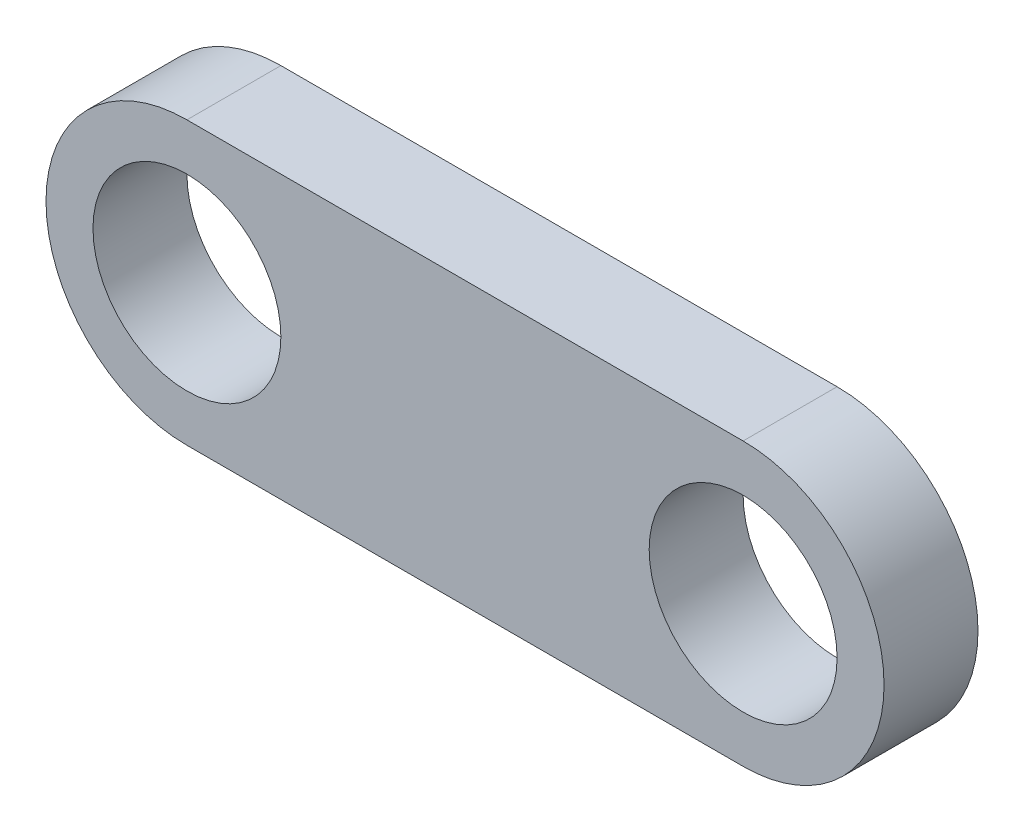
ISO-10303-21;
HEADER;
FILE_DESCRIPTION(('STEP AP214'),'2;1');
FILE_NAME('part.step','',(''),(''),'','','');
FILE_SCHEMA(('AUTOMOTIVE_DESIGN { 1 0 10303 214 1 1 1 1 }'));
ENDSEC;
DATA;
#1=APPLICATION_CONTEXT('core data for automotive mechanical design processes');
#2=APPLICATION_PROTOCOL_DEFINITION('international standard','automotive_design',2000,#1);
#3=PRODUCT_CONTEXT('',#1,'mechanical');
#4=PRODUCT('Part','Part','',(#3));
#5=PRODUCT_RELATED_PRODUCT_CATEGORY('part','',(#4));
#6=PRODUCT_DEFINITION_FORMATION('','',#4);
#7=PRODUCT_DEFINITION_CONTEXT('part definition',#1,'design');
#8=PRODUCT_DEFINITION('design','',#6,#7);
#9=PRODUCT_DEFINITION_SHAPE('','',#8);
#10=(LENGTH_UNIT() NAMED_UNIT(*) SI_UNIT(.MILLI.,.METRE.));
#11=(NAMED_UNIT(*) PLANE_ANGLE_UNIT() SI_UNIT($,.RADIAN.));
#12=(NAMED_UNIT(*) SI_UNIT($,.STERADIAN.) SOLID_ANGLE_UNIT());
#13=UNCERTAINTY_MEASURE_WITH_UNIT(LENGTH_MEASURE(1.E-05),#10,'distance_accuracy_value','');
#14=(GEOMETRIC_REPRESENTATION_CONTEXT(3) GLOBAL_UNCERTAINTY_ASSIGNED_CONTEXT((#13)) GLOBAL_UNIT_ASSIGNED_CONTEXT((#10,
#11,#12)) REPRESENTATION_CONTEXT('',''));
#15=CARTESIAN_POINT('',(0.,0.,0.));
#16=DIRECTION('',(0.,0.,1.));
#17=DIRECTION('',(1.,0.,0.));
#18=AXIS2_PLACEMENT_3D('',#15,#16,#17);
#19=CARTESIAN_POINT('',(0.,0.,0.5));
#20=DIRECTION('',(0.,0.,1.));
#21=DIRECTION('',(1.,0.,0.));
#22=AXIS2_PLACEMENT_3D('',#19,#20,#21);
#23=PLANE('',#22);
#24=CARTESIAN_POINT('',(-5.92,0.,0.5));
#25=DIRECTION('',(0.,0.,1.));
#26=DIRECTION('',(1.,0.,0.));
#27=AXIS2_PLACEMENT_3D('',#24,#25,#26);
#28=CIRCLE('',#27,1.);
#29=CARTESIAN_POINT('',(-4.92,0.,0.5));
#30=VERTEX_POINT('',#29);
#31=EDGE_CURVE('E102',#30,#30,#28,.T.);
#32=ORIENTED_EDGE('',*,*,#31,.F.);
#33=EDGE_LOOP('',(#32));
#34=FACE_BOUND('',#33,.T.);
#35=CARTESIAN_POINT('',(0.,0.,0.5));
#36=DIRECTION('',(0.,0.,1.));
#37=DIRECTION('',(1.,0.,0.));
#38=AXIS2_PLACEMENT_3D('',#35,#36,#37);
#39=CIRCLE('',#38,1.5);
#40=CARTESIAN_POINT('',(0.,-1.5,0.5));
#41=VERTEX_POINT('',#40);
#42=CARTESIAN_POINT('',(0.,1.5,0.5));
#43=VERTEX_POINT('',#42);
#44=EDGE_CURVE('E87',#41,#43,#39,.T.);
#45=ORIENTED_EDGE('',*,*,#44,.T.);
#46=DIRECTION('',(-1.,0.,0.));
#47=VECTOR('',#46,1.);
#48=CARTESIAN_POINT('',(0.,1.5,0.5));
#49=LINE('',#48,#47);
#50=CARTESIAN_POINT('',(-5.92,1.5,0.5));
#51=VERTEX_POINT('',#50);
#52=EDGE_CURVE('E82',#43,#51,#49,.T.);
#53=ORIENTED_EDGE('',*,*,#52,.T.);
#54=CARTESIAN_POINT('',(-5.92,0.,0.5));
#55=DIRECTION('',(0.,0.,1.));
#56=DIRECTION('',(1.,0.,0.));
#57=AXIS2_PLACEMENT_3D('',#54,#55,#56);
#58=CIRCLE('',#57,1.5);
#59=CARTESIAN_POINT('',(-5.92,-1.5,0.5));
#60=VERTEX_POINT('',#59);
#61=EDGE_CURVE('E85',#51,#60,#58,.T.);
#62=ORIENTED_EDGE('',*,*,#61,.T.);
#63=DIRECTION('',(1.,0.,0.));
#64=VECTOR('',#63,1.);
#65=CARTESIAN_POINT('',(0.,-1.5,0.5));
#66=LINE('',#65,#64);
#67=EDGE_CURVE('E52',#60,#41,#66,.T.);
#68=ORIENTED_EDGE('',*,*,#67,.T.);
#69=EDGE_LOOP('',(#45,#53,#62,#68));
#70=FACE_BOUND('',#69,.T.);
#71=CARTESIAN_POINT('',(0.,0.,0.5));
#72=DIRECTION('',(0.,0.,1.));
#73=DIRECTION('',(1.,0.,0.));
#74=AXIS2_PLACEMENT_3D('',#71,#72,#73);
#75=CIRCLE('',#74,1.);
#76=CARTESIAN_POINT('',(1.,0.,0.5));
#77=VERTEX_POINT('',#76);
#78=EDGE_CURVE('E117',#77,#77,#75,.T.);
#79=ORIENTED_EDGE('',*,*,#78,.F.);
#80=EDGE_LOOP('',(#79));
#81=FACE_BOUND('',#80,.T.);
#82=ADVANCED_FACE('F35',(#34,#70,#81),#23,.T.);
#83=CARTESIAN_POINT('',(0.,0.,-0.5));
#84=DIRECTION('',(0.,0.,1.));
#85=DIRECTION('',(1.,0.,0.));
#86=AXIS2_PLACEMENT_3D('',#83,#84,#85);
#87=PLANE('',#86);
#88=CARTESIAN_POINT('',(0.,0.,-0.5));
#89=DIRECTION('',(0.,0.,1.));
#90=DIRECTION('',(1.,0.,0.));
#91=AXIS2_PLACEMENT_3D('',#88,#89,#90);
#92=CIRCLE('',#91,1.5);
#93=CARTESIAN_POINT('',(0.,-1.5,-0.5));
#94=VERTEX_POINT('',#93);
#95=CARTESIAN_POINT('',(0.,1.5,-0.5));
#96=VERTEX_POINT('',#95);
#97=EDGE_CURVE('E99',#94,#96,#92,.T.);
#98=ORIENTED_EDGE('',*,*,#97,.F.);
#99=DIRECTION('',(1.,0.,0.));
#100=VECTOR('',#99,1.);
#101=CARTESIAN_POINT('',(0.,-1.5,-0.5));
#102=LINE('',#101,#100);
#103=CARTESIAN_POINT('',(-5.92,-1.5,-0.5));
#104=VERTEX_POINT('',#103);
#105=EDGE_CURVE('E75',#104,#94,#102,.T.);
#106=ORIENTED_EDGE('',*,*,#105,.F.);
#107=CARTESIAN_POINT('',(-5.92,0.,-0.5));
#108=DIRECTION('',(0.,0.,1.));
#109=DIRECTION('',(1.,0.,0.));
#110=AXIS2_PLACEMENT_3D('',#107,#108,#109);
#111=CIRCLE('',#110,1.5);
#112=CARTESIAN_POINT('',(-5.92,1.5,-0.5));
#113=VERTEX_POINT('',#112);
#114=EDGE_CURVE('E69',#113,#104,#111,.T.);
#115=ORIENTED_EDGE('',*,*,#114,.F.);
#116=DIRECTION('',(-1.,0.,0.));
#117=VECTOR('',#116,1.);
#118=CARTESIAN_POINT('',(0.,1.5,-0.5));
#119=LINE('',#118,#117);
#120=EDGE_CURVE('E91',#96,#113,#119,.T.);
#121=ORIENTED_EDGE('',*,*,#120,.F.);
#122=EDGE_LOOP('',(#98,#106,#115,#121));
#123=FACE_BOUND('',#122,.T.);
#124=CARTESIAN_POINT('',(-5.92,0.,-0.5));
#125=DIRECTION('',(0.,0.,1.));
#126=DIRECTION('',(1.,0.,0.));
#127=AXIS2_PLACEMENT_3D('',#124,#125,#126);
#128=CIRCLE('',#127,1.);
#129=CARTESIAN_POINT('',(-4.92,0.,-0.5));
#130=VERTEX_POINT('',#129);
#131=EDGE_CURVE('E114',#130,#130,#128,.T.);
#132=ORIENTED_EDGE('',*,*,#131,.T.);
#133=EDGE_LOOP('',(#132));
#134=FACE_BOUND('',#133,.T.);
#135=CARTESIAN_POINT('',(0.,0.,-0.5));
#136=DIRECTION('',(0.,0.,1.));
#137=DIRECTION('',(1.,0.,0.));
#138=AXIS2_PLACEMENT_3D('',#135,#136,#137);
#139=CIRCLE('',#138,1.);
#140=CARTESIAN_POINT('',(1.,0.,-0.5));
#141=VERTEX_POINT('',#140);
#142=EDGE_CURVE('E120',#141,#141,#139,.T.);
#143=ORIENTED_EDGE('',*,*,#142,.T.);
#144=EDGE_LOOP('',(#143));
#145=FACE_BOUND('',#144,.T.);
#146=ADVANCED_FACE('F110',(#123,#134,#145),#87,.F.);
#147=CARTESIAN_POINT('',(0.,0.,0.5));
#148=DIRECTION('',(0.,0.,-1.));
#149=DIRECTION('',(-1.,0.,0.));
#150=AXIS2_PLACEMENT_3D('',#147,#148,#149);
#151=CYLINDRICAL_SURFACE('',#150,1.5);
#152=ORIENTED_EDGE('',*,*,#97,.T.);
#153=DIRECTION('',(0.,0.,-1.));
#154=VECTOR('',#153,1.);
#155=CARTESIAN_POINT('',(0.,1.5,0.5));
#156=LINE('',#155,#154);
#157=EDGE_CURVE('E11',#43,#96,#156,.T.);
#158=ORIENTED_EDGE('',*,*,#157,.F.);
#159=ORIENTED_EDGE('',*,*,#44,.F.);
#160=DIRECTION('',(0.,0.,-1.));
#161=VECTOR('',#160,1.);
#162=CARTESIAN_POINT('',(0.,-1.5,0.5));
#163=LINE('',#162,#161);
#164=EDGE_CURVE('E95',#41,#94,#163,.T.);
#165=ORIENTED_EDGE('',*,*,#164,.T.);
#166=EDGE_LOOP('',(#152,#158,#159,#165));
#167=FACE_BOUND('',#166,.T.);
#168=ADVANCED_FACE('F37',(#167),#151,.T.);
#169=CARTESIAN_POINT('',(0.,1.5,0.5));
#170=DIRECTION('',(0.,-1.,0.));
#171=DIRECTION('',(1.,0.,0.));
#172=AXIS2_PLACEMENT_3D('',#169,#170,#171);
#173=PLANE('',#172);
#174=ORIENTED_EDGE('',*,*,#120,.T.);
#175=DIRECTION('',(0.,0.,-1.));
#176=VECTOR('',#175,1.);
#177=CARTESIAN_POINT('',(-5.92,1.5,0.5));
#178=LINE('',#177,#176);
#179=EDGE_CURVE('E44',#51,#113,#178,.T.);
#180=ORIENTED_EDGE('',*,*,#179,.F.);
#181=ORIENTED_EDGE('',*,*,#52,.F.);
#182=ORIENTED_EDGE('',*,*,#157,.T.);
#183=EDGE_LOOP('',(#174,#180,#181,#182));
#184=FACE_BOUND('',#183,.T.);
#185=ADVANCED_FACE('F90',(#184),#173,.F.);
#186=CARTESIAN_POINT('',(-5.92,0.,0.5));
#187=DIRECTION('',(0.,0.,-1.));
#188=DIRECTION('',(-1.,0.,0.));
#189=AXIS2_PLACEMENT_3D('',#186,#187,#188);
#190=CYLINDRICAL_SURFACE('',#189,1.5);
#191=ORIENTED_EDGE('',*,*,#114,.T.);
#192=DIRECTION('',(0.,0.,-1.));
#193=VECTOR('',#192,1.);
#194=CARTESIAN_POINT('',(-5.92,-1.5,0.5));
#195=LINE('',#194,#193);
#196=EDGE_CURVE('E92',#60,#104,#195,.T.);
#197=ORIENTED_EDGE('',*,*,#196,.F.);
#198=ORIENTED_EDGE('',*,*,#61,.F.);
#199=ORIENTED_EDGE('',*,*,#179,.T.);
#200=EDGE_LOOP('',(#191,#197,#198,#199));
#201=FACE_BOUND('',#200,.T.);
#202=ADVANCED_FACE('F93',(#201),#190,.T.);
#203=CARTESIAN_POINT('',(0.,-1.5,0.5));
#204=DIRECTION('',(0.,1.,0.));
#205=DIRECTION('',(-1.,0.,0.));
#206=AXIS2_PLACEMENT_3D('',#203,#204,#205);
#207=PLANE('',#206);
#208=ORIENTED_EDGE('',*,*,#105,.T.);
#209=ORIENTED_EDGE('',*,*,#164,.F.);
#210=ORIENTED_EDGE('',*,*,#67,.F.);
#211=ORIENTED_EDGE('',*,*,#196,.T.);
#212=EDGE_LOOP('',(#208,#209,#210,#211));
#213=FACE_BOUND('',#212,.T.);
#214=ADVANCED_FACE('F107',(#213),#207,.F.);
#215=CARTESIAN_POINT('',(-5.92,0.,0.5));
#216=DIRECTION('',(0.,0.,-1.));
#217=DIRECTION('',(-1.,0.,0.));
#218=AXIS2_PLACEMENT_3D('',#215,#216,#217);
#219=CYLINDRICAL_SURFACE('',#218,1.);
#220=ORIENTED_EDGE('',*,*,#31,.T.);
#221=EDGE_LOOP('',(#220));
#222=FACE_BOUND('',#221,.T.);
#223=ORIENTED_EDGE('',*,*,#131,.F.);
#224=EDGE_LOOP('',(#223));
#225=FACE_BOUND('',#224,.T.);
#226=ADVANCED_FACE('F137',(#222,#225),#219,.F.);
#227=CARTESIAN_POINT('',(0.,0.,0.5));
#228=DIRECTION('',(0.,0.,-1.));
#229=DIRECTION('',(-1.,0.,0.));
#230=AXIS2_PLACEMENT_3D('',#227,#228,#229);
#231=CYLINDRICAL_SURFACE('',#230,1.);
#232=ORIENTED_EDGE('',*,*,#78,.T.);
#233=EDGE_LOOP('',(#232));
#234=FACE_BOUND('',#233,.T.);
#235=ORIENTED_EDGE('',*,*,#142,.F.);
#236=EDGE_LOOP('',(#235));
#237=FACE_BOUND('',#236,.T.);
#238=ADVANCED_FACE('F126',(#234,#237),#231,.F.);
#239=CLOSED_SHELL('',(#82,#146,#168,#185,#202,#214,#226,#238));
#240=MANIFOLD_SOLID_BREP('B2',#239);
#241=ADVANCED_BREP_SHAPE_REPRESENTATION('',(#18,#240),#14);
#242=SHAPE_DEFINITION_REPRESENTATION(#9,#241);
ENDSEC;
END-ISO-10303-21;
